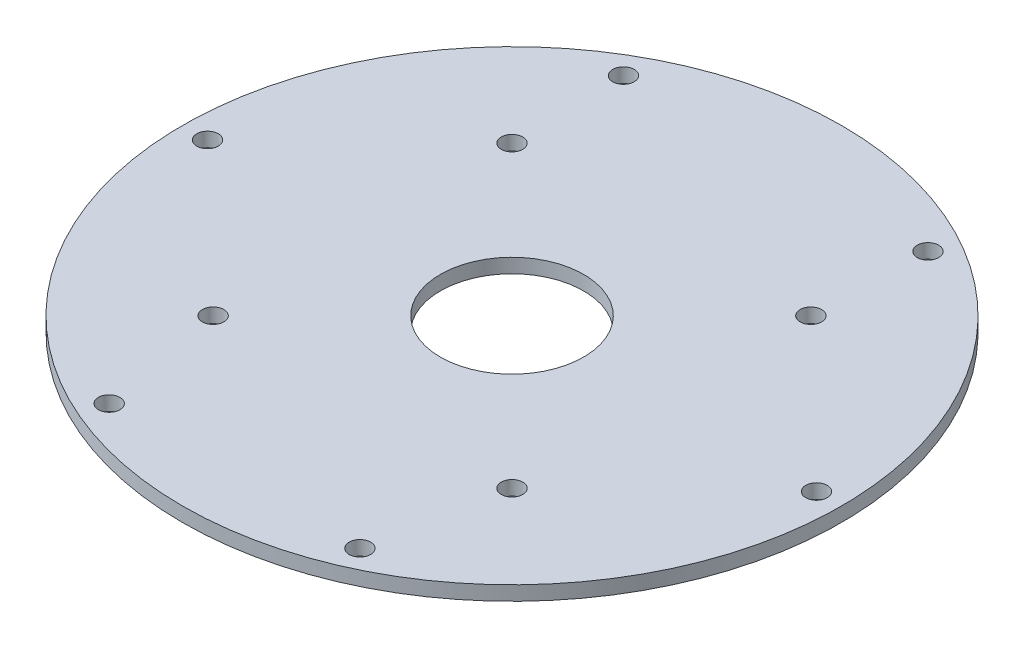
ISO-10303-21;
HEADER;
FILE_DESCRIPTION(('STEP AP214'),'2;1');
FILE_NAME('part.step','',(''),(''),'','','');
FILE_SCHEMA(('AUTOMOTIVE_DESIGN { 1 0 10303 214 1 1 1 1 }'));
ENDSEC;
DATA;
#1=APPLICATION_CONTEXT('core data for automotive mechanical design processes');
#2=APPLICATION_PROTOCOL_DEFINITION('international standard','automotive_design',2000,#1);
#3=PRODUCT_CONTEXT('',#1,'mechanical');
#4=PRODUCT('Part','Part','',(#3));
#5=PRODUCT_RELATED_PRODUCT_CATEGORY('part','',(#4));
#6=PRODUCT_DEFINITION_FORMATION('','',#4);
#7=PRODUCT_DEFINITION_CONTEXT('part definition',#1,'design');
#8=PRODUCT_DEFINITION('design','',#6,#7);
#9=PRODUCT_DEFINITION_SHAPE('','',#8);
#10=(LENGTH_UNIT() NAMED_UNIT(*) SI_UNIT(.MILLI.,.METRE.));
#11=(NAMED_UNIT(*) PLANE_ANGLE_UNIT() SI_UNIT($,.RADIAN.));
#12=(NAMED_UNIT(*) SI_UNIT($,.STERADIAN.) SOLID_ANGLE_UNIT());
#13=UNCERTAINTY_MEASURE_WITH_UNIT(LENGTH_MEASURE(1.E-05),#10,'distance_accuracy_value','');
#14=(GEOMETRIC_REPRESENTATION_CONTEXT(3) GLOBAL_UNCERTAINTY_ASSIGNED_CONTEXT((#13)) GLOBAL_UNIT_ASSIGNED_CONTEXT((#10,
#11,#12)) REPRESENTATION_CONTEXT('',''));
#15=CARTESIAN_POINT('',(0.,0.,0.));
#16=DIRECTION('',(0.,0.,1.));
#17=DIRECTION('',(1.,0.,0.));
#18=AXIS2_PLACEMENT_3D('',#15,#16,#17);
#19=CARTESIAN_POINT('',(0.,2.,0.));
#20=DIRECTION('',(0.,-1.,0.));
#21=DIRECTION('',(0.,0.,-1.));
#22=AXIS2_PLACEMENT_3D('',#19,#20,#21);
#23=CYLINDRICAL_SURFACE('',#22,46.);
#24=CARTESIAN_POINT('',(0.,2.,0.));
#25=DIRECTION('',(0.,1.,0.));
#26=DIRECTION('',(0.,0.,1.));
#27=AXIS2_PLACEMENT_3D('',#24,#25,#26);
#28=CIRCLE('',#27,46.);
#29=CARTESIAN_POINT('',(0.,2.,46.));
#30=VERTEX_POINT('',#29);
#31=EDGE_CURVE('E10',#30,#30,#28,.T.);
#32=ORIENTED_EDGE('',*,*,#31,.F.);
#33=EDGE_LOOP('',(#32));
#34=FACE_BOUND('',#33,.T.);
#35=CARTESIAN_POINT('',(0.,0.,0.));
#36=DIRECTION('',(0.,1.,0.));
#37=DIRECTION('',(0.,0.,1.));
#38=AXIS2_PLACEMENT_3D('',#35,#36,#37);
#39=CIRCLE('',#38,46.);
#40=CARTESIAN_POINT('',(0.,0.,46.));
#41=VERTEX_POINT('',#40);
#42=EDGE_CURVE('E42',#41,#41,#39,.T.);
#43=ORIENTED_EDGE('',*,*,#42,.T.);
#44=EDGE_LOOP('',(#43));
#45=FACE_BOUND('',#44,.T.);
#46=ADVANCED_FACE('F39',(#34,#45),#23,.T.);
#47=CARTESIAN_POINT('',(0.,2.,0.));
#48=DIRECTION('',(0.,1.,0.));
#49=DIRECTION('',(0.,0.,1.));
#50=AXIS2_PLACEMENT_3D('',#47,#48,#49);
#51=PLANE('',#50);
#52=CARTESIAN_POINT('',(0.,2.,0.));
#53=DIRECTION('',(0.,1.,0.));
#54=DIRECTION('',(0.,0.,1.));
#55=AXIS2_PLACEMENT_3D('',#52,#53,#54);
#56=CIRCLE('',#55,10.);
#57=CARTESIAN_POINT('',(0.,2.,10.));
#58=VERTEX_POINT('',#57);
#59=EDGE_CURVE('E111',#58,#58,#56,.T.);
#60=ORIENTED_EDGE('',*,*,#59,.F.);
#61=EDGE_LOOP('',(#60));
#62=FACE_BOUND('',#61,.T.);
#63=CARTESIAN_POINT('',(20.8596500450033,2.,20.859650045003));
#64=DIRECTION('',(0.,1.,0.));
#65=DIRECTION('',(0.,0.,1.));
#66=AXIS2_PLACEMENT_3D('',#63,#64,#65);
#67=CIRCLE('',#66,1.5);
#68=CARTESIAN_POINT('',(20.8596500450033,2.,22.359650045003));
#69=VERTEX_POINT('',#68);
#70=EDGE_CURVE('E93',#69,#69,#67,.T.);
#71=ORIENTED_EDGE('',*,*,#70,.F.);
#72=EDGE_LOOP('',(#71));
#73=FACE_BOUND('',#72,.T.);
#74=CARTESIAN_POINT('',(20.859650045003,2.,-20.8596500450033));
#75=DIRECTION('',(0.,1.,0.));
#76=DIRECTION('',(0.,0.,1.));
#77=AXIS2_PLACEMENT_3D('',#74,#75,#76);
#78=CIRCLE('',#77,1.5);
#79=CARTESIAN_POINT('',(20.859650045003,2.,-19.3596500450033));
#80=VERTEX_POINT('',#79);
#81=EDGE_CURVE('E100',#80,#80,#78,.T.);
#82=ORIENTED_EDGE('',*,*,#81,.F.);
#83=EDGE_LOOP('',(#82));
#84=FACE_BOUND('',#83,.T.);
#85=CARTESIAN_POINT('',(-20.8596500450033,2.,-20.859650045003));
#86=DIRECTION('',(0.,1.,0.));
#87=DIRECTION('',(0.,0.,1.));
#88=AXIS2_PLACEMENT_3D('',#85,#86,#87);
#89=CIRCLE('',#88,1.5);
#90=CARTESIAN_POINT('',(-20.8596500450033,2.,-19.359650045003));
#91=VERTEX_POINT('',#90);
#92=EDGE_CURVE('E106',#91,#91,#89,.T.);
#93=ORIENTED_EDGE('',*,*,#92,.F.);
#94=EDGE_LOOP('',(#93));
#95=FACE_BOUND('',#94,.T.);
#96=CARTESIAN_POINT('',(-20.859650045003,2.,20.8596500450033));
#97=DIRECTION('',(0.,1.,0.));
#98=DIRECTION('',(0.,0.,1.));
#99=AXIS2_PLACEMENT_3D('',#96,#97,#98);
#100=CIRCLE('',#99,1.5);
#101=CARTESIAN_POINT('',(-20.859650045003,2.,22.3596500450033));
#102=VERTEX_POINT('',#101);
#103=EDGE_CURVE('E87',#102,#102,#100,.T.);
#104=ORIENTED_EDGE('',*,*,#103,.F.);
#105=EDGE_LOOP('',(#104));
#106=FACE_BOUND('',#105,.T.);
#107=CARTESIAN_POINT('',(-42.5,2.,-2.1163626406917E-13));
#108=DIRECTION('',(0.,1.,0.));
#109=DIRECTION('',(0.,0.,1.));
#110=AXIS2_PLACEMENT_3D('',#107,#108,#109);
#111=CIRCLE('',#110,1.5);
#112=CARTESIAN_POINT('',(-42.5,2.,1.49999999999979));
#113=VERTEX_POINT('',#112);
#114=EDGE_CURVE('E57',#113,#113,#111,.T.);
#115=ORIENTED_EDGE('',*,*,#114,.F.);
#116=EDGE_LOOP('',(#115));
#117=FACE_BOUND('',#116,.T.);
#118=CARTESIAN_POINT('',(-17.5,2.,38.7298334620742));
#119=DIRECTION('',(0.,1.,0.));
#120=DIRECTION('',(0.,0.,1.));
#121=AXIS2_PLACEMENT_3D('',#118,#119,#120);
#122=CIRCLE('',#121,1.5);
#123=CARTESIAN_POINT('',(-17.5,2.,40.2298334620742));
#124=VERTEX_POINT('',#123);
#125=EDGE_CURVE('E72',#124,#124,#122,.T.);
#126=ORIENTED_EDGE('',*,*,#125,.F.);
#127=EDGE_LOOP('',(#126));
#128=FACE_BOUND('',#127,.T.);
#129=CARTESIAN_POINT('',(21.2500000000002,2.,-36.8060796608385));
#130=DIRECTION('',(0.,1.,0.));
#131=DIRECTION('',(0.,0.,1.));
#132=AXIS2_PLACEMENT_3D('',#129,#130,#131);
#133=CIRCLE('',#132,1.5);
#134=CARTESIAN_POINT('',(21.2500000000002,2.,-35.3060796608385));
#135=VERTEX_POINT('',#134);
#136=EDGE_CURVE('E65',#135,#135,#133,.T.);
#137=ORIENTED_EDGE('',*,*,#136,.F.);
#138=EDGE_LOOP('',(#137));
#139=FACE_BOUND('',#138,.T.);
#140=CARTESIAN_POINT('',(42.5,2.,2.32452945780892E-13));
#141=DIRECTION('',(0.,1.,0.));
#142=DIRECTION('',(0.,0.,1.));
#143=AXIS2_PLACEMENT_3D('',#140,#141,#142);
#144=CIRCLE('',#143,1.5);
#145=CARTESIAN_POINT('',(42.5,2.,1.50000000000024));
#146=VERTEX_POINT('',#145);
#147=EDGE_CURVE('E82',#146,#146,#144,.T.);
#148=ORIENTED_EDGE('',*,*,#147,.F.);
#149=EDGE_LOOP('',(#148));
#150=FACE_BOUND('',#149,.T.);
#151=CARTESIAN_POINT('',(17.5,2.,38.7298334620742));
#152=DIRECTION('',(0.,1.,0.));
#153=DIRECTION('',(0.,0.,-1.));
#154=AXIS2_PLACEMENT_3D('',#151,#152,#153);
#155=CIRCLE('',#154,1.5);
#156=CARTESIAN_POINT('',(17.5,2.,37.2298334620742));
#157=VERTEX_POINT('',#156);
#158=EDGE_CURVE('E64',#157,#157,#155,.T.);
#159=ORIENTED_EDGE('',*,*,#158,.F.);
#160=EDGE_LOOP('',(#159));
#161=FACE_BOUND('',#160,.T.);
#162=CARTESIAN_POINT('',(-21.2499999999998,2.,-36.8060796608388));
#163=DIRECTION('',(0.,1.,0.));
#164=DIRECTION('',(0.,0.,1.));
#165=AXIS2_PLACEMENT_3D('',#162,#163,#164);
#166=CIRCLE('',#165,1.5);
#167=CARTESIAN_POINT('',(-21.2499999999998,2.,-35.3060796608388));
#168=VERTEX_POINT('',#167);
#169=EDGE_CURVE('E51',#168,#168,#166,.T.);
#170=ORIENTED_EDGE('',*,*,#169,.F.);
#171=EDGE_LOOP('',(#170));
#172=FACE_BOUND('',#171,.T.);
#173=ORIENTED_EDGE('',*,*,#31,.T.);
#174=EDGE_LOOP('',(#173));
#175=FACE_BOUND('',#174,.T.);
#176=ADVANCED_FACE('F127',(#62,#73,#84,#95,#106,#117,#128,#139,#150,#161,#172,#175),#51,.T.);
#177=CARTESIAN_POINT('',(0.,0.,0.));
#178=DIRECTION('',(0.,1.,0.));
#179=DIRECTION('',(0.,0.,1.));
#180=AXIS2_PLACEMENT_3D('',#177,#178,#179);
#181=PLANE('',#180);
#182=CARTESIAN_POINT('',(0.,0.,0.));
#183=DIRECTION('',(0.,1.,0.));
#184=DIRECTION('',(0.,0.,1.));
#185=AXIS2_PLACEMENT_3D('',#182,#183,#184);
#186=CIRCLE('',#185,10.);
#187=CARTESIAN_POINT('',(0.,0.,10.));
#188=VERTEX_POINT('',#187);
#189=EDGE_CURVE('E97',#188,#188,#186,.T.);
#190=ORIENTED_EDGE('',*,*,#189,.T.);
#191=EDGE_LOOP('',(#190));
#192=FACE_BOUND('',#191,.T.);
#193=CARTESIAN_POINT('',(20.8596500450033,0.,20.859650045003));
#194=DIRECTION('',(0.,1.,0.));
#195=DIRECTION('',(0.,0.,1.));
#196=AXIS2_PLACEMENT_3D('',#193,#194,#195);
#197=CIRCLE('',#196,1.5);
#198=CARTESIAN_POINT('',(20.8596500450033,0.,22.359650045003));
#199=VERTEX_POINT('',#198);
#200=EDGE_CURVE('E96',#199,#199,#197,.T.);
#201=ORIENTED_EDGE('',*,*,#200,.T.);
#202=EDGE_LOOP('',(#201));
#203=FACE_BOUND('',#202,.T.);
#204=CARTESIAN_POINT('',(20.859650045003,0.,-20.8596500450033));
#205=DIRECTION('',(0.,1.,0.));
#206=DIRECTION('',(0.,0.,1.));
#207=AXIS2_PLACEMENT_3D('',#204,#205,#206);
#208=CIRCLE('',#207,1.5);
#209=CARTESIAN_POINT('',(20.859650045003,0.,-19.3596500450033));
#210=VERTEX_POINT('',#209);
#211=EDGE_CURVE('E103',#210,#210,#208,.T.);
#212=ORIENTED_EDGE('',*,*,#211,.T.);
#213=EDGE_LOOP('',(#212));
#214=FACE_BOUND('',#213,.T.);
#215=CARTESIAN_POINT('',(-20.8596500450033,0.,-20.859650045003));
#216=DIRECTION('',(0.,1.,0.));
#217=DIRECTION('',(0.,0.,1.));
#218=AXIS2_PLACEMENT_3D('',#215,#216,#217);
#219=CIRCLE('',#218,1.5);
#220=CARTESIAN_POINT('',(-20.8596500450033,0.,-19.359650045003));
#221=VERTEX_POINT('',#220);
#222=EDGE_CURVE('E90',#221,#221,#219,.T.);
#223=ORIENTED_EDGE('',*,*,#222,.T.);
#224=EDGE_LOOP('',(#223));
#225=FACE_BOUND('',#224,.T.);
#226=CARTESIAN_POINT('',(-20.859650045003,0.,20.8596500450033));
#227=DIRECTION('',(0.,1.,0.));
#228=DIRECTION('',(0.,0.,1.));
#229=AXIS2_PLACEMENT_3D('',#226,#227,#228);
#230=CIRCLE('',#229,1.5);
#231=CARTESIAN_POINT('',(-20.859650045003,0.,22.3596500450033));
#232=VERTEX_POINT('',#231);
#233=EDGE_CURVE('E61',#232,#232,#230,.T.);
#234=ORIENTED_EDGE('',*,*,#233,.T.);
#235=EDGE_LOOP('',(#234));
#236=FACE_BOUND('',#235,.T.);
#237=CARTESIAN_POINT('',(-42.5,0.,-2.1163626406917E-13));
#238=DIRECTION('',(0.,1.,0.));
#239=DIRECTION('',(0.,0.,1.));
#240=AXIS2_PLACEMENT_3D('',#237,#238,#239);
#241=CIRCLE('',#240,1.5);
#242=CARTESIAN_POINT('',(-42.5,0.,1.49999999999979));
#243=VERTEX_POINT('',#242);
#244=EDGE_CURVE('E60',#243,#243,#241,.T.);
#245=ORIENTED_EDGE('',*,*,#244,.T.);
#246=EDGE_LOOP('',(#245));
#247=FACE_BOUND('',#246,.T.);
#248=CARTESIAN_POINT('',(-17.5,0.,38.7298334620742));
#249=DIRECTION('',(0.,1.,0.));
#250=DIRECTION('',(0.,0.,1.));
#251=AXIS2_PLACEMENT_3D('',#248,#249,#250);
#252=CIRCLE('',#251,1.5);
#253=CARTESIAN_POINT('',(-17.5,0.,40.2298334620742));
#254=VERTEX_POINT('',#253);
#255=EDGE_CURVE('E54',#254,#254,#252,.T.);
#256=ORIENTED_EDGE('',*,*,#255,.T.);
#257=EDGE_LOOP('',(#256));
#258=FACE_BOUND('',#257,.T.);
#259=CARTESIAN_POINT('',(21.2500000000002,0.,-36.8060796608385));
#260=DIRECTION('',(0.,1.,0.));
#261=DIRECTION('',(0.,0.,1.));
#262=AXIS2_PLACEMENT_3D('',#259,#260,#261);
#263=CIRCLE('',#262,1.5);
#264=CARTESIAN_POINT('',(21.2500000000002,0.,-35.3060796608385));
#265=VERTEX_POINT('',#264);
#266=EDGE_CURVE('E68',#265,#265,#263,.T.);
#267=ORIENTED_EDGE('',*,*,#266,.T.);
#268=EDGE_LOOP('',(#267));
#269=FACE_BOUND('',#268,.T.);
#270=CARTESIAN_POINT('',(42.5,0.,2.32452945780892E-13));
#271=DIRECTION('',(0.,1.,0.));
#272=DIRECTION('',(0.,0.,1.));
#273=AXIS2_PLACEMENT_3D('',#270,#271,#272);
#274=CIRCLE('',#273,1.5);
#275=CARTESIAN_POINT('',(42.5,0.,1.50000000000024));
#276=VERTEX_POINT('',#275);
#277=EDGE_CURVE('E69',#276,#276,#274,.T.);
#278=ORIENTED_EDGE('',*,*,#277,.T.);
#279=EDGE_LOOP('',(#278));
#280=FACE_BOUND('',#279,.T.);
#281=CARTESIAN_POINT('',(17.5,0.,38.7298334620742));
#282=DIRECTION('',(0.,1.,0.));
#283=DIRECTION('',(0.,0.,-1.));
#284=AXIS2_PLACEMENT_3D('',#281,#282,#283);
#285=CIRCLE('',#284,1.5);
#286=CARTESIAN_POINT('',(17.5,0.,37.2298334620742));
#287=VERTEX_POINT('',#286);
#288=EDGE_CURVE('E79',#287,#287,#285,.T.);
#289=ORIENTED_EDGE('',*,*,#288,.T.);
#290=EDGE_LOOP('',(#289));
#291=FACE_BOUND('',#290,.T.);
#292=CARTESIAN_POINT('',(-21.2499999999998,0.,-36.8060796608388));
#293=DIRECTION('',(0.,1.,0.));
#294=DIRECTION('',(0.,0.,1.));
#295=AXIS2_PLACEMENT_3D('',#292,#293,#294);
#296=CIRCLE('',#295,1.5);
#297=CARTESIAN_POINT('',(-21.2499999999998,0.,-35.3060796608388));
#298=VERTEX_POINT('',#297);
#299=EDGE_CURVE('E49',#298,#298,#296,.T.);
#300=ORIENTED_EDGE('',*,*,#299,.T.);
#301=EDGE_LOOP('',(#300));
#302=FACE_BOUND('',#301,.T.);
#303=ORIENTED_EDGE('',*,*,#42,.F.);
#304=EDGE_LOOP('',(#303));
#305=FACE_BOUND('',#304,.T.);
#306=ADVANCED_FACE('F117',(#192,#203,#214,#225,#236,#247,#258,#269,#280,#291,#302,#305),#181,.F.);
#307=CARTESIAN_POINT('',(-21.2499999999998,0.,-36.8060796608388));
#308=DIRECTION('',(0.,1.,0.));
#309=DIRECTION('',(0.,0.,1.));
#310=AXIS2_PLACEMENT_3D('',#307,#308,#309);
#311=CYLINDRICAL_SURFACE('',#310,1.5);
#312=ORIENTED_EDGE('',*,*,#299,.F.);
#313=EDGE_LOOP('',(#312));
#314=FACE_BOUND('',#313,.T.);
#315=ORIENTED_EDGE('',*,*,#169,.T.);
#316=EDGE_LOOP('',(#315));
#317=FACE_BOUND('',#316,.T.);
#318=ADVANCED_FACE('F151',(#314,#317),#311,.F.);
#319=CARTESIAN_POINT('',(17.5,0.,38.7298334620742));
#320=DIRECTION('',(0.,1.,0.));
#321=DIRECTION('',(0.,0.,1.));
#322=AXIS2_PLACEMENT_3D('',#319,#320,#321);
#323=CYLINDRICAL_SURFACE('',#322,1.5);
#324=ORIENTED_EDGE('',*,*,#288,.F.);
#325=EDGE_LOOP('',(#324));
#326=FACE_BOUND('',#325,.T.);
#327=ORIENTED_EDGE('',*,*,#158,.T.);
#328=EDGE_LOOP('',(#327));
#329=FACE_BOUND('',#328,.T.);
#330=ADVANCED_FACE('F153',(#326,#329),#323,.F.);
#331=CARTESIAN_POINT('',(42.5,0.,2.32452945780892E-13));
#332=DIRECTION('',(0.,1.,0.));
#333=DIRECTION('',(0.,0.,1.));
#334=AXIS2_PLACEMENT_3D('',#331,#332,#333);
#335=CYLINDRICAL_SURFACE('',#334,1.5);
#336=ORIENTED_EDGE('',*,*,#277,.F.);
#337=EDGE_LOOP('',(#336));
#338=FACE_BOUND('',#337,.T.);
#339=ORIENTED_EDGE('',*,*,#147,.T.);
#340=EDGE_LOOP('',(#339));
#341=FACE_BOUND('',#340,.T.);
#342=ADVANCED_FACE('F160',(#338,#341),#335,.F.);
#343=CARTESIAN_POINT('',(21.2500000000002,0.,-36.8060796608385));
#344=DIRECTION('',(0.,1.,0.));
#345=DIRECTION('',(0.,0.,1.));
#346=AXIS2_PLACEMENT_3D('',#343,#344,#345);
#347=CYLINDRICAL_SURFACE('',#346,1.5);
#348=ORIENTED_EDGE('',*,*,#266,.F.);
#349=EDGE_LOOP('',(#348));
#350=FACE_BOUND('',#349,.T.);
#351=ORIENTED_EDGE('',*,*,#136,.T.);
#352=EDGE_LOOP('',(#351));
#353=FACE_BOUND('',#352,.T.);
#354=ADVANCED_FACE('F234',(#350,#353),#347,.F.);
#355=CARTESIAN_POINT('',(-17.5,0.,38.7298334620742));
#356=DIRECTION('',(0.,1.,0.));
#357=DIRECTION('',(0.,0.,1.));
#358=AXIS2_PLACEMENT_3D('',#355,#356,#357);
#359=CYLINDRICAL_SURFACE('',#358,1.5);
#360=ORIENTED_EDGE('',*,*,#255,.F.);
#361=EDGE_LOOP('',(#360));
#362=FACE_BOUND('',#361,.T.);
#363=ORIENTED_EDGE('',*,*,#125,.T.);
#364=EDGE_LOOP('',(#363));
#365=FACE_BOUND('',#364,.T.);
#366=ADVANCED_FACE('F227',(#362,#365),#359,.F.);
#367=CARTESIAN_POINT('',(-42.5,0.,-2.1163626406917E-13));
#368=DIRECTION('',(0.,1.,0.));
#369=DIRECTION('',(0.,0.,1.));
#370=AXIS2_PLACEMENT_3D('',#367,#368,#369);
#371=CYLINDRICAL_SURFACE('',#370,1.5);
#372=ORIENTED_EDGE('',*,*,#244,.F.);
#373=EDGE_LOOP('',(#372));
#374=FACE_BOUND('',#373,.T.);
#375=ORIENTED_EDGE('',*,*,#114,.T.);
#376=EDGE_LOOP('',(#375));
#377=FACE_BOUND('',#376,.T.);
#378=ADVANCED_FACE('F219',(#374,#377),#371,.F.);
#379=CARTESIAN_POINT('',(-20.859650045003,0.,20.8596500450033));
#380=DIRECTION('',(0.,1.,0.));
#381=DIRECTION('',(0.,0.,1.));
#382=AXIS2_PLACEMENT_3D('',#379,#380,#381);
#383=CYLINDRICAL_SURFACE('',#382,1.5);
#384=ORIENTED_EDGE('',*,*,#233,.F.);
#385=EDGE_LOOP('',(#384));
#386=FACE_BOUND('',#385,.T.);
#387=ORIENTED_EDGE('',*,*,#103,.T.);
#388=EDGE_LOOP('',(#387));
#389=FACE_BOUND('',#388,.T.);
#390=ADVANCED_FACE('F211',(#386,#389),#383,.F.);
#391=CARTESIAN_POINT('',(-20.8596500450033,0.,-20.859650045003));
#392=DIRECTION('',(0.,1.,0.));
#393=DIRECTION('',(0.,0.,1.));
#394=AXIS2_PLACEMENT_3D('',#391,#392,#393);
#395=CYLINDRICAL_SURFACE('',#394,1.5);
#396=ORIENTED_EDGE('',*,*,#222,.F.);
#397=EDGE_LOOP('',(#396));
#398=FACE_BOUND('',#397,.T.);
#399=ORIENTED_EDGE('',*,*,#92,.T.);
#400=EDGE_LOOP('',(#399));
#401=FACE_BOUND('',#400,.T.);
#402=ADVANCED_FACE('F203',(#398,#401),#395,.F.);
#403=CARTESIAN_POINT('',(20.859650045003,0.,-20.8596500450033));
#404=DIRECTION('',(0.,1.,0.));
#405=DIRECTION('',(0.,0.,1.));
#406=AXIS2_PLACEMENT_3D('',#403,#404,#405);
#407=CYLINDRICAL_SURFACE('',#406,1.5);
#408=ORIENTED_EDGE('',*,*,#211,.F.);
#409=EDGE_LOOP('',(#408));
#410=FACE_BOUND('',#409,.T.);
#411=ORIENTED_EDGE('',*,*,#81,.T.);
#412=EDGE_LOOP('',(#411));
#413=FACE_BOUND('',#412,.T.);
#414=ADVANCED_FACE('F196',(#410,#413),#407,.F.);
#415=CARTESIAN_POINT('',(20.8596500450033,0.,20.859650045003));
#416=DIRECTION('',(0.,1.,0.));
#417=DIRECTION('',(0.,0.,1.));
#418=AXIS2_PLACEMENT_3D('',#415,#416,#417);
#419=CYLINDRICAL_SURFACE('',#418,1.5);
#420=ORIENTED_EDGE('',*,*,#200,.F.);
#421=EDGE_LOOP('',(#420));
#422=FACE_BOUND('',#421,.T.);
#423=ORIENTED_EDGE('',*,*,#70,.T.);
#424=EDGE_LOOP('',(#423));
#425=FACE_BOUND('',#424,.T.);
#426=ADVANCED_FACE('F123',(#422,#425),#419,.F.);
#427=CARTESIAN_POINT('',(0.,0.,0.));
#428=DIRECTION('',(0.,1.,0.));
#429=DIRECTION('',(0.,0.,1.));
#430=AXIS2_PLACEMENT_3D('',#427,#428,#429);
#431=CYLINDRICAL_SURFACE('',#430,10.);
#432=ORIENTED_EDGE('',*,*,#189,.F.);
#433=EDGE_LOOP('',(#432));
#434=FACE_BOUND('',#433,.T.);
#435=ORIENTED_EDGE('',*,*,#59,.T.);
#436=EDGE_LOOP('',(#435));
#437=FACE_BOUND('',#436,.T.);
#438=ADVANCED_FACE('F120',(#434,#437),#431,.F.);
#439=CLOSED_SHELL('',(#46,#176,#306,#318,#330,#342,#354,#366,#378,#390,#402,#414,#426,#438));
#440=MANIFOLD_SOLID_BREP('B2',#439);
#441=ADVANCED_BREP_SHAPE_REPRESENTATION('',(#18,#440),#14);
#442=SHAPE_DEFINITION_REPRESENTATION(#9,#441);
ENDSEC;
END-ISO-10303-21;
